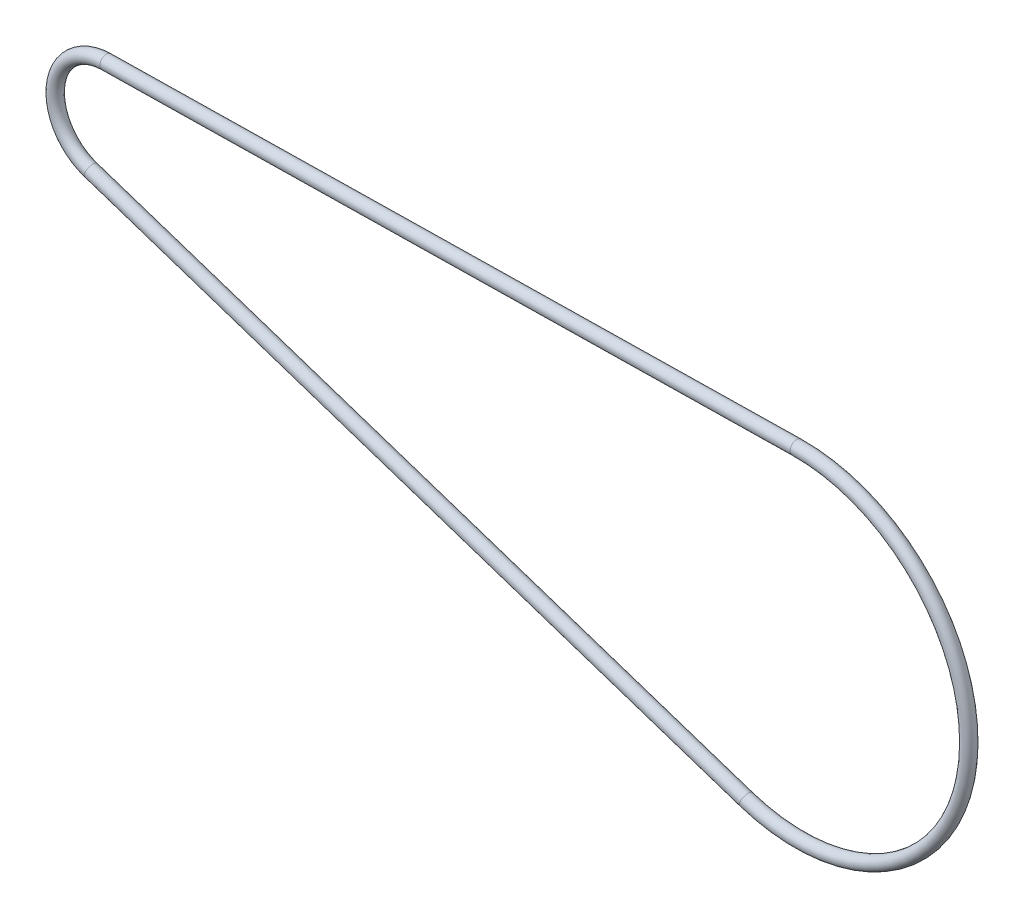
ISO-10303-21;
HEADER;
FILE_DESCRIPTION(('STEP AP214'),'2;1');
FILE_NAME('part.step','',(''),(''),'','','');
FILE_SCHEMA(('AUTOMOTIVE_DESIGN { 1 0 10303 214 1 1 1 1 }'));
ENDSEC;
DATA;
#1=APPLICATION_CONTEXT('core data for automotive mechanical design processes');
#2=APPLICATION_PROTOCOL_DEFINITION('international standard','automotive_design',2000,#1);
#3=PRODUCT_CONTEXT('',#1,'mechanical');
#4=PRODUCT('Part','Part','',(#3));
#5=PRODUCT_RELATED_PRODUCT_CATEGORY('part','',(#4));
#6=PRODUCT_DEFINITION_FORMATION('','',#4);
#7=PRODUCT_DEFINITION_CONTEXT('part definition',#1,'design');
#8=PRODUCT_DEFINITION('design','',#6,#7);
#9=PRODUCT_DEFINITION_SHAPE('','',#8);
#10=(LENGTH_UNIT() NAMED_UNIT(*) SI_UNIT(.MILLI.,.METRE.));
#11=(NAMED_UNIT(*) PLANE_ANGLE_UNIT() SI_UNIT($,.RADIAN.));
#12=(NAMED_UNIT(*) SI_UNIT($,.STERADIAN.) SOLID_ANGLE_UNIT());
#13=UNCERTAINTY_MEASURE_WITH_UNIT(LENGTH_MEASURE(1.E-05),#10,'distance_accuracy_value','');
#14=(GEOMETRIC_REPRESENTATION_CONTEXT(3) GLOBAL_UNCERTAINTY_ASSIGNED_CONTEXT((#13)) GLOBAL_UNIT_ASSIGNED_CONTEXT((#10,
#11,#12)) REPRESENTATION_CONTEXT('',''));
#15=CARTESIAN_POINT('',(0.,0.,0.));
#16=DIRECTION('',(0.,0.,1.));
#17=DIRECTION('',(1.,0.,0.));
#18=AXIS2_PLACEMENT_3D('',#15,#16,#17);
#19=CARTESIAN_POINT('',(-425.1,65.,43.5));
#20=DIRECTION('',(0.,0.,-1.));
#21=DIRECTION('',(-1.,0.,0.));
#22=AXIS2_PLACEMENT_3D('',#19,#20,#21);
#23=TOROIDAL_SURFACE('',#22,32.0000000000001,4.);
#24=CARTESIAN_POINT('',(-435.164557823007,34.6239456836909,43.5));
#25=DIRECTION('',(0.949251697384658,-0.314517431968953,0.));
#26=DIRECTION('',(0.314517431968953,0.949251697384658,0.));
#27=AXIS2_PLACEMENT_3D('',#24,#25,#26);
#28=CIRCLE('',#27,4.);
#29=CARTESIAN_POINT('',(-436.422627550883,30.8269388941523,43.5));
#30=VERTEX_POINT('',#29);
#31=EDGE_CURVE('E62',#30,#30,#28,.T.);
#32=CARTESIAN_POINT('',(-425.627599930141,96.995650303029,43.5));
#33=DIRECTION('',(-0.999864071969654,-0.016487497816921,0.));
#34=DIRECTION('',(0.016487497816921,-0.999864071969654,0.));
#35=AXIS2_PLACEMENT_3D('',#32,#33,#34);
#36=CIRCLE('',#35,4.);
#37=CARTESIAN_POINT('',(-425.693549921409,100.995106590908,43.5));
#38=VERTEX_POINT('',#37);
#39=EDGE_CURVE('E58',#38,#38,#36,.T.);
#40=CARTESIAN_POINT('',(-425.1,65.,43.5));
#41=DIRECTION('',(0.,0.,-1.));
#42=DIRECTION('',(-1.,0.,0.));
#43=AXIS2_PLACEMENT_3D('',#40,#41,#42);
#44=CIRCLE('',#43,36.0000000000001);
#45=EDGE_CURVE('',#30,#38,#44,.T.);
#46=ORIENTED_EDGE('',*,*,#31,.F.);
#47=ORIENTED_EDGE('',*,*,#39,.T.);
#48=ORIENTED_EDGE('',*,*,#45,.T.);
#49=ORIENTED_EDGE('',*,*,#45,.F.);
#50=EDGE_LOOP('',(#46,#48,#47,#49));
#51=FACE_BOUND('',#50,.T.);
#52=ADVANCED_FACE('F47',(#51),#23,.T.);
#53=CARTESIAN_POINT('',(-425.627599930141,96.995650303029,43.5));
#54=DIRECTION('',(0.999864071969654,0.0164874978169195,0.));
#55=DIRECTION('',(-0.0164874978169195,0.999864071969654,0.));
#56=AXIS2_PLACEMENT_3D('',#53,#54,#55);
#57=CYLINDRICAL_SURFACE('',#56,4.);
#58=CARTESIAN_POINT('',(-1.71469977295952,103.985863484844,43.5));
#59=DIRECTION('',(-0.999864071969654,-0.0164874978169219,0.));
#60=DIRECTION('',(0.0164874978169219,-0.999864071969654,0.));
#61=AXIS2_PLACEMENT_3D('',#58,#59,#60);
#62=CIRCLE('',#61,4.);
#63=CARTESIAN_POINT('',(-1.78064976422715,107.985319772723,43.5));
#64=VERTEX_POINT('',#63);
#65=EDGE_CURVE('E54',#64,#64,#62,.T.);
#66=CARTESIAN_POINT('',(-1.78064976422715,107.985319772723,43.5));
#67=CARTESIAN_POINT('',(-6.19640914086447,107.912505052079,43.5));
#68=CARTESIAN_POINT('',(-10.6121685175018,107.839690331435,43.5));
#69=CARTESIAN_POINT('',(-19.4436872707764,107.694060890147,43.5));
#70=CARTESIAN_POINT('',(-23.8594466474137,107.621246169503,43.5));
#71=CARTESIAN_POINT('',(-32.6909654006883,107.475616728215,43.5));
#72=CARTESIAN_POINT('',(-37.1067247773256,107.402802007571,43.5));
#73=CARTESIAN_POINT('',(-45.9382435306002,107.257172566284,43.5));
#74=CARTESIAN_POINT('',(-50.3540029072376,107.18435784564,43.5));
#75=CARTESIAN_POINT('',(-59.1855216605122,107.038728404352,43.5));
#76=CARTESIAN_POINT('',(-63.6012810371495,106.965913683708,43.5));
#77=CARTESIAN_POINT('',(-72.4327997904241,106.82028424242,43.5));
#78=CARTESIAN_POINT('',(-76.8485591670614,106.747469521776,43.5));
#79=CARTESIAN_POINT('',(-85.680077920336,106.601840080488,43.5));
#80=CARTESIAN_POINT('',(-90.0958372969733,106.529025359845,43.5));
#81=CARTESIAN_POINT('',(-98.9273560502479,106.383395918557,43.5));
#82=CARTESIAN_POINT('',(-103.343115426885,106.310581197913,43.5));
#83=CARTESIAN_POINT('',(-112.17463418016,106.164951756625,43.5));
#84=CARTESIAN_POINT('',(-116.590393556797,106.092137035981,43.5));
#85=CARTESIAN_POINT('',(-125.421912310072,105.946507594693,43.5));
#86=CARTESIAN_POINT('',(-129.837671686709,105.873692874049,43.5));
#87=CARTESIAN_POINT('',(-138.669190439984,105.728063432762,43.5));
#88=CARTESIAN_POINT('',(-143.084949816621,105.655248712118,43.5));
#89=CARTESIAN_POINT('',(-151.916468569896,105.50961927083,43.5));
#90=CARTESIAN_POINT('',(-156.332227946533,105.436804550186,43.5));
#91=CARTESIAN_POINT('',(-165.163746699808,105.291175108898,43.5));
#92=CARTESIAN_POINT('',(-169.579506076445,105.218360388254,43.5));
#93=CARTESIAN_POINT('',(-178.41102482972,105.072730946966,43.5));
#94=CARTESIAN_POINT('',(-182.826784206357,104.999916226323,43.5));
#95=CARTESIAN_POINT('',(-191.658302959631,104.854286785035,43.5));
#96=CARTESIAN_POINT('',(-196.074062336269,104.781472064391,43.5));
#97=CARTESIAN_POINT('',(-204.905581089543,104.635842623103,43.5));
#98=CARTESIAN_POINT('',(-209.321340466181,104.563027902459,43.5));
#99=CARTESIAN_POINT('',(-218.152859219455,104.417398461171,43.5));
#100=CARTESIAN_POINT('',(-222.568618596093,104.344583740527,43.5));
#101=CARTESIAN_POINT('',(-231.400137349367,104.19895429924,43.5));
#102=CARTESIAN_POINT('',(-235.815896726005,104.126139578596,43.5));
#103=CARTESIAN_POINT('',(-244.647415479279,103.980510137308,43.5));
#104=CARTESIAN_POINT('',(-249.063174855917,103.907695416664,43.5));
#105=CARTESIAN_POINT('',(-257.894693609191,103.762065975376,43.5));
#106=CARTESIAN_POINT('',(-262.310452985828,103.689251254732,43.5));
#107=CARTESIAN_POINT('',(-271.141971739103,103.543621813444,43.5));
#108=CARTESIAN_POINT('',(-275.55773111574,103.4708070928,43.5));
#109=CARTESIAN_POINT('',(-284.389249869015,103.325177651513,43.5));
#110=CARTESIAN_POINT('',(-288.805009245652,103.252362930869,43.5));
#111=CARTESIAN_POINT('',(-297.636527998927,103.106733489581,43.5));
#112=CARTESIAN_POINT('',(-302.052287375564,103.033918768937,43.5));
#113=CARTESIAN_POINT('',(-310.883806128839,102.888289327649,43.5));
#114=CARTESIAN_POINT('',(-315.299565505476,102.815474607005,43.5));
#115=CARTESIAN_POINT('',(-324.131084258751,102.669845165717,43.5));
#116=CARTESIAN_POINT('',(-328.546843635388,102.597030445074,43.5));
#117=CARTESIAN_POINT('',(-337.378362388663,102.451401003786,43.5));
#118=CARTESIAN_POINT('',(-341.7941217653,102.378586283142,43.5));
#119=CARTESIAN_POINT('',(-350.625640518575,102.232956841854,43.5));
#120=CARTESIAN_POINT('',(-355.041399895212,102.16014212121,43.5));
#121=CARTESIAN_POINT('',(-363.872918648487,102.014512679922,43.5));
#122=CARTESIAN_POINT('',(-368.288678025124,101.941697959278,43.5));
#123=CARTESIAN_POINT('',(-377.120196778398,101.796068517991,43.5));
#124=CARTESIAN_POINT('',(-381.535956155036,101.723253797347,43.5));
#125=CARTESIAN_POINT('',(-390.36747490831,101.577624356059,43.5));
#126=CARTESIAN_POINT('',(-394.783234284948,101.504809635415,43.5));
#127=CARTESIAN_POINT('',(-403.614753038222,101.359180194127,43.5));
#128=CARTESIAN_POINT('',(-408.03051241486,101.286365473483,43.5));
#129=CARTESIAN_POINT('',(-416.862031168134,101.140736032195,43.5));
#130=CARTESIAN_POINT('',(-421.277790544772,101.067921311552,43.5));
#131=CARTESIAN_POINT('',(-425.693549921409,100.995106590908,43.5));
#132=B_SPLINE_CURVE_WITH_KNOTS('',3,(#66,#67,#68,#69,#70,#71,#72,#73,#74,#75,#76,#77,#78,#79,
#80,#81,#82,#83,#84,#85,#86,#87,#88,#89,#90,#91,#92,#93,#94,#95,#96,#97,#98,#99,#100,#101,#102,
#103,#104,#105,#106,#107,#108,#109,#110,#111,#112,#113,#114,#115,#116,#117,#118,#119,#120,#121,
#122,#123,#124,#125,#126,#127,#128,#129,#130,#131),.UNSPECIFIED.,.F.,.F.,(4,2,2,2,2,2,2,2,2,2,2,
2,2,2,2,2,2,2,2,2,2,2,2,2,2,2,2,2,2,2,2,2,4),(0.,13.2490790511313,26.4981581022625,
39.7472371533937,52.996316204525,66.2453952556563,79.4944743067875,92.7435533579187,
105.99263240905,119.241711460181,132.490790511312,145.739869562444,158.988948613575,
172.238027664706,185.487106715838,198.736185766969,211.9852648181,225.234343869231,
238.483422920363,251.732501971494,264.981581022625,278.230660073756,291.479739124887,
304.728818176019,317.97789722715,331.226976278281,344.476055329412,357.725134380544,
370.974213431675,384.223292482806,397.472371533938,410.721450585069,423.9705296362),.UNSPECIFIED.);
#133=EDGE_CURVE('BSEAM71',#64,#38,#132,.T.);
#134=ORIENTED_EDGE('',*,*,#65,.T.);
#135=ORIENTED_EDGE('',*,*,#39,.F.);
#136=ORIENTED_EDGE('',*,*,#133,.T.);
#137=ORIENTED_EDGE('',*,*,#133,.F.);
#138=EDGE_LOOP('',(#134,#136,#135,#137));
#139=FACE_BOUND('',#138,.T.);
#140=ADVANCED_FACE('F71',(#139),#57,.T.);
#141=CARTESIAN_POINT('',(0.,0.,43.5));
#142=DIRECTION('',(0.,0.,-1.));
#143=DIRECTION('',(-1.,0.,0.));
#144=AXIS2_PLACEMENT_3D('',#141,#142,#143);
#145=TOROIDAL_SURFACE('',#144,104.,4.);
#146=CARTESIAN_POINT('',(-32.7098129247714,-98.722176528004,43.5));
#147=DIRECTION('',(0.949251697384658,-0.314517431968953,0.));
#148=DIRECTION('',(0.314517431968953,0.949251697384658,0.));
#149=AXIS2_PLACEMENT_3D('',#146,#147,#148);
#150=CIRCLE('',#149,4.);
#151=CARTESIAN_POINT('',(-33.9678826526474,-102.519183317543,43.5));
#152=VERTEX_POINT('',#151);
#153=EDGE_CURVE('E11',#152,#152,#150,.T.);
#154=CARTESIAN_POINT('',(0.,0.,43.5));
#155=DIRECTION('',(0.,0.,-1.));
#156=DIRECTION('',(-1.,0.,0.));
#157=AXIS2_PLACEMENT_3D('',#154,#155,#156);
#158=CIRCLE('',#157,108.);
#159=EDGE_CURVE('',#64,#152,#158,.T.);
#160=ORIENTED_EDGE('',*,*,#65,.F.);
#161=ORIENTED_EDGE('',*,*,#153,.T.);
#162=ORIENTED_EDGE('',*,*,#159,.T.);
#163=ORIENTED_EDGE('',*,*,#159,.F.);
#164=EDGE_LOOP('',(#160,#162,#161,#163));
#165=FACE_BOUND('',#164,.T.);
#166=ADVANCED_FACE('F77',(#165),#145,.T.);
#167=CARTESIAN_POINT('',(-32.7098129247715,-98.7221765280041,43.5));
#168=DIRECTION('',(-0.949251697384658,0.314517431968955,0.));
#169=DIRECTION('',(-0.314517431968955,-0.949251697384658,0.));
#170=AXIS2_PLACEMENT_3D('',#167,#168,#169);
#171=CYLINDRICAL_SURFACE('',#170,4.);
#172=ORIENTED_EDGE('',*,*,#31,.T.);
#173=EDGE_LOOP('',(#172));
#174=FACE_BOUND('',#173,.T.);
#175=ORIENTED_EDGE('',*,*,#153,.F.);
#176=EDGE_LOOP('',(#175));
#177=FACE_BOUND('',#176,.T.);
#178=ADVANCED_FACE('F49',(#174,#177),#171,.T.);
#179=CLOSED_SHELL('',(#52,#140,#166,#178));
#180=MANIFOLD_SOLID_BREP('B2',#179);
#181=ADVANCED_BREP_SHAPE_REPRESENTATION('',(#18,#180),#14);
#182=SHAPE_DEFINITION_REPRESENTATION(#9,#181);
ENDSEC;
END-ISO-10303-21;
